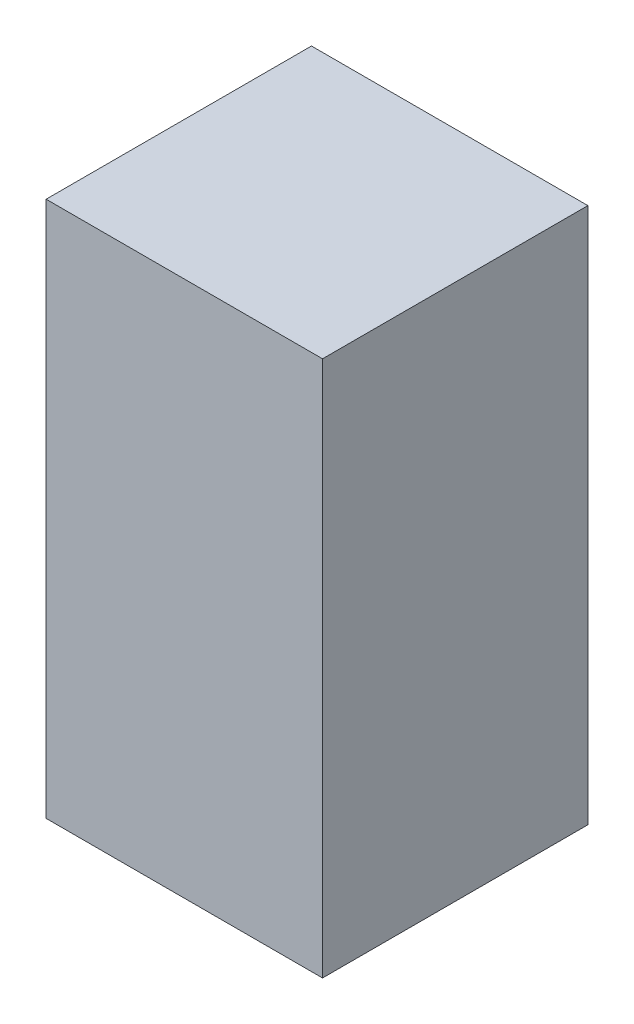
ISO-10303-21;
HEADER;
FILE_DESCRIPTION(('STEP AP214'),'2;1');
FILE_NAME('part.step','',(''),(''),'','','');
FILE_SCHEMA(('AUTOMOTIVE_DESIGN { 1 0 10303 214 1 1 1 1 }'));
ENDSEC;
DATA;
#1=APPLICATION_CONTEXT('core data for automotive mechanical design processes');
#2=APPLICATION_PROTOCOL_DEFINITION('international standard','automotive_design',2000,#1);
#3=PRODUCT_CONTEXT('',#1,'mechanical');
#4=PRODUCT('Part','Part','',(#3));
#5=PRODUCT_RELATED_PRODUCT_CATEGORY('part','',(#4));
#6=PRODUCT_DEFINITION_FORMATION('','',#4);
#7=PRODUCT_DEFINITION_CONTEXT('part definition',#1,'design');
#8=PRODUCT_DEFINITION('design','',#6,#7);
#9=PRODUCT_DEFINITION_SHAPE('','',#8);
#10=(LENGTH_UNIT() NAMED_UNIT(*) SI_UNIT(.MILLI.,.METRE.));
#11=(NAMED_UNIT(*) PLANE_ANGLE_UNIT() SI_UNIT($,.RADIAN.));
#12=(NAMED_UNIT(*) SI_UNIT($,.STERADIAN.) SOLID_ANGLE_UNIT());
#13=UNCERTAINTY_MEASURE_WITH_UNIT(LENGTH_MEASURE(1.E-05),#10,'distance_accuracy_value','');
#14=(GEOMETRIC_REPRESENTATION_CONTEXT(3) GLOBAL_UNCERTAINTY_ASSIGNED_CONTEXT((#13)) GLOBAL_UNIT_ASSIGNED_CONTEXT((#10,
#11,#12)) REPRESENTATION_CONTEXT('',''));
#15=CARTESIAN_POINT('',(0.,0.,0.));
#16=DIRECTION('',(0.,0.,1.));
#17=DIRECTION('',(1.,0.,0.));
#18=AXIS2_PLACEMENT_3D('',#15,#16,#17);
#19=CARTESIAN_POINT('',(0.,0.,1219.2));
#20=DIRECTION('',(1.,0.,0.));
#21=DIRECTION('',(0.,0.,-1.));
#22=AXIS2_PLACEMENT_3D('',#19,#20,#21);
#23=PLANE('',#22);
#24=DIRECTION('',(0.,-1.,0.));
#25=VECTOR('',#24,1.);
#26=CARTESIAN_POINT('',(0.,0.,0.));
#27=LINE('',#26,#25);
#28=CARTESIAN_POINT('',(0.,2463.8,0.));
#29=VERTEX_POINT('',#28);
#30=CARTESIAN_POINT('',(0.,0.,0.));
#31=VERTEX_POINT('',#30);
#32=EDGE_CURVE('E96',#29,#31,#27,.T.);
#33=ORIENTED_EDGE('',*,*,#32,.T.);
#34=DIRECTION('',(0.,0.,-1.));
#35=VECTOR('',#34,1.);
#36=CARTESIAN_POINT('',(0.,0.,1219.2));
#37=LINE('',#36,#35);
#38=CARTESIAN_POINT('',(0.,0.,1219.2));
#39=VERTEX_POINT('',#38);
#40=EDGE_CURVE('E11',#39,#31,#37,.T.);
#41=ORIENTED_EDGE('',*,*,#40,.F.);
#42=DIRECTION('',(0.,-1.,0.));
#43=VECTOR('',#42,1.);
#44=CARTESIAN_POINT('',(0.,0.,1219.2));
#45=LINE('',#44,#43);
#46=CARTESIAN_POINT('',(0.,2463.8,1219.2));
#47=VERTEX_POINT('',#46);
#48=EDGE_CURVE('E84',#47,#39,#45,.T.);
#49=ORIENTED_EDGE('',*,*,#48,.F.);
#50=DIRECTION('',(0.,0.,-1.));
#51=VECTOR('',#50,1.);
#52=CARTESIAN_POINT('',(0.,2463.8,1219.2));
#53=LINE('',#52,#51);
#54=EDGE_CURVE('E92',#47,#29,#53,.T.);
#55=ORIENTED_EDGE('',*,*,#54,.T.);
#56=EDGE_LOOP('',(#33,#41,#49,#55));
#57=FACE_BOUND('',#56,.T.);
#58=ADVANCED_FACE('F33',(#57),#23,.F.);
#59=CARTESIAN_POINT('',(0.,0.,1219.2));
#60=DIRECTION('',(0.,1.,0.));
#61=DIRECTION('',(0.,0.,1.));
#62=AXIS2_PLACEMENT_3D('',#59,#60,#61);
#63=PLANE('',#62);
#64=DIRECTION('',(1.,0.,0.));
#65=VECTOR('',#64,1.);
#66=CARTESIAN_POINT('',(0.,0.,0.));
#67=LINE('',#66,#65);
#68=CARTESIAN_POINT('',(1270.,0.,0.));
#69=VERTEX_POINT('',#68);
#70=EDGE_CURVE('E88',#31,#69,#67,.T.);
#71=ORIENTED_EDGE('',*,*,#70,.T.);
#72=DIRECTION('',(0.,0.,-1.));
#73=VECTOR('',#72,1.);
#74=CARTESIAN_POINT('',(1270.,0.,1219.2));
#75=LINE('',#74,#73);
#76=CARTESIAN_POINT('',(1270.,0.,1219.2));
#77=VERTEX_POINT('',#76);
#78=EDGE_CURVE('E41',#77,#69,#75,.T.);
#79=ORIENTED_EDGE('',*,*,#78,.F.);
#80=DIRECTION('',(1.,0.,0.));
#81=VECTOR('',#80,1.);
#82=CARTESIAN_POINT('',(0.,0.,1219.2));
#83=LINE('',#82,#81);
#84=EDGE_CURVE('E79',#39,#77,#83,.T.);
#85=ORIENTED_EDGE('',*,*,#84,.F.);
#86=ORIENTED_EDGE('',*,*,#40,.T.);
#87=EDGE_LOOP('',(#71,#79,#85,#86));
#88=FACE_BOUND('',#87,.T.);
#89=ADVANCED_FACE('F87',(#88),#63,.F.);
#90=CARTESIAN_POINT('',(1270.,0.,1219.2));
#91=DIRECTION('',(-1.,0.,0.));
#92=DIRECTION('',(0.,0.,1.));
#93=AXIS2_PLACEMENT_3D('',#90,#91,#92);
#94=PLANE('',#93);
#95=DIRECTION('',(0.,1.,0.));
#96=VECTOR('',#95,1.);
#97=CARTESIAN_POINT('',(1270.,0.,0.));
#98=LINE('',#97,#96);
#99=CARTESIAN_POINT('',(1270.,2463.8,0.));
#100=VERTEX_POINT('',#99);
#101=EDGE_CURVE('E66',#69,#100,#98,.T.);
#102=ORIENTED_EDGE('',*,*,#101,.T.);
#103=DIRECTION('',(0.,0.,-1.));
#104=VECTOR('',#103,1.);
#105=CARTESIAN_POINT('',(1270.,2463.8,1219.2));
#106=LINE('',#105,#104);
#107=CARTESIAN_POINT('',(1270.,2463.8,1219.2));
#108=VERTEX_POINT('',#107);
#109=EDGE_CURVE('E89',#108,#100,#106,.T.);
#110=ORIENTED_EDGE('',*,*,#109,.F.);
#111=DIRECTION('',(0.,1.,0.));
#112=VECTOR('',#111,1.);
#113=CARTESIAN_POINT('',(1270.,0.,1219.2));
#114=LINE('',#113,#112);
#115=EDGE_CURVE('E82',#77,#108,#114,.T.);
#116=ORIENTED_EDGE('',*,*,#115,.F.);
#117=ORIENTED_EDGE('',*,*,#78,.T.);
#118=EDGE_LOOP('',(#102,#110,#116,#117));
#119=FACE_BOUND('',#118,.T.);
#120=ADVANCED_FACE('F90',(#119),#94,.F.);
#121=CARTESIAN_POINT('',(0.,2463.8,1219.2));
#122=DIRECTION('',(0.,-1.,0.));
#123=DIRECTION('',(0.,0.,-1.));
#124=AXIS2_PLACEMENT_3D('',#121,#122,#123);
#125=PLANE('',#124);
#126=DIRECTION('',(-1.,0.,0.));
#127=VECTOR('',#126,1.);
#128=CARTESIAN_POINT('',(0.,2463.8,0.));
#129=LINE('',#128,#127);
#130=EDGE_CURVE('E72',#100,#29,#129,.T.);
#131=ORIENTED_EDGE('',*,*,#130,.T.);
#132=ORIENTED_EDGE('',*,*,#54,.F.);
#133=DIRECTION('',(-1.,0.,0.));
#134=VECTOR('',#133,1.);
#135=CARTESIAN_POINT('',(0.,2463.8,1219.2));
#136=LINE('',#135,#134);
#137=EDGE_CURVE('E49',#108,#47,#136,.T.);
#138=ORIENTED_EDGE('',*,*,#137,.F.);
#139=ORIENTED_EDGE('',*,*,#109,.T.);
#140=EDGE_LOOP('',(#131,#132,#138,#139));
#141=FACE_BOUND('',#140,.T.);
#142=ADVANCED_FACE('F103',(#141),#125,.F.);
#143=CARTESIAN_POINT('',(0.,0.,1219.2));
#144=DIRECTION('',(0.,0.,-1.));
#145=DIRECTION('',(-1.,0.,0.));
#146=AXIS2_PLACEMENT_3D('',#143,#144,#145);
#147=PLANE('',#146);
#148=ORIENTED_EDGE('',*,*,#48,.T.);
#149=ORIENTED_EDGE('',*,*,#84,.T.);
#150=ORIENTED_EDGE('',*,*,#115,.T.);
#151=ORIENTED_EDGE('',*,*,#137,.T.);
#152=EDGE_LOOP('',(#148,#149,#150,#151));
#153=FACE_BOUND('',#152,.T.);
#154=ADVANCED_FACE('F80',(#153),#147,.F.);
#155=CARTESIAN_POINT('',(0.,0.,0.));
#156=DIRECTION('',(0.,0.,-1.));
#157=DIRECTION('',(-1.,0.,0.));
#158=AXIS2_PLACEMENT_3D('',#155,#156,#157);
#159=PLANE('',#158);
#160=ORIENTED_EDGE('',*,*,#32,.F.);
#161=ORIENTED_EDGE('',*,*,#130,.F.);
#162=ORIENTED_EDGE('',*,*,#101,.F.);
#163=ORIENTED_EDGE('',*,*,#70,.F.);
#164=EDGE_LOOP('',(#160,#161,#162,#163));
#165=FACE_BOUND('',#164,.T.);
#166=ADVANCED_FACE('F106',(#165),#159,.T.);
#167=CLOSED_SHELL('',(#58,#89,#120,#142,#154,#166));
#168=MANIFOLD_SOLID_BREP('B2',#167);
#169=ADVANCED_BREP_SHAPE_REPRESENTATION('',(#18,#168),#14);
#170=SHAPE_DEFINITION_REPRESENTATION(#9,#169);
ENDSEC;
END-ISO-10303-21;
